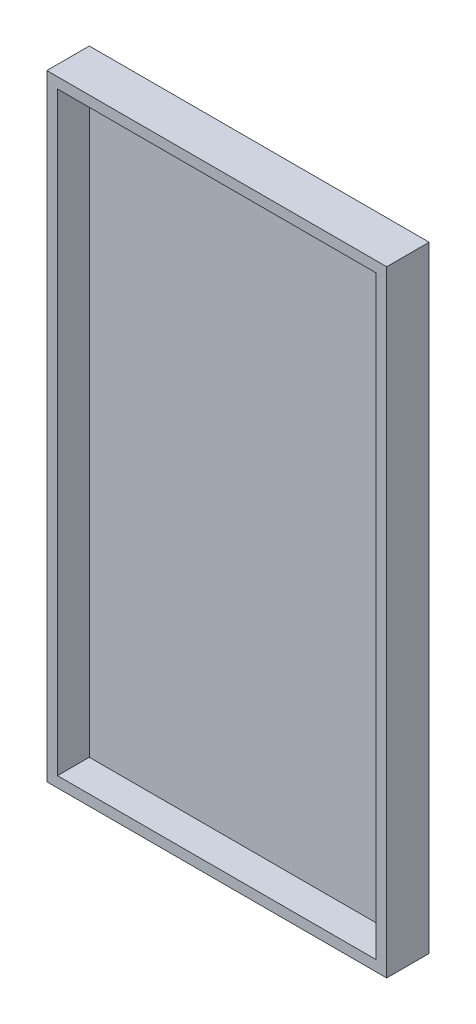
ISO-10303-21;
HEADER;
FILE_DESCRIPTION(('STEP AP214'),'2;1');
FILE_NAME('part.step','',(''),(''),'','','');
FILE_SCHEMA(('AUTOMOTIVE_DESIGN { 1 0 10303 214 1 1 1 1 }'));
ENDSEC;
DATA;
#1=APPLICATION_CONTEXT('core data for automotive mechanical design processes');
#2=APPLICATION_PROTOCOL_DEFINITION('international standard','automotive_design',2000,#1);
#3=PRODUCT_CONTEXT('',#1,'mechanical');
#4=PRODUCT('Part','Part','',(#3));
#5=PRODUCT_RELATED_PRODUCT_CATEGORY('part','',(#4));
#6=PRODUCT_DEFINITION_FORMATION('','',#4);
#7=PRODUCT_DEFINITION_CONTEXT('part definition',#1,'design');
#8=PRODUCT_DEFINITION('design','',#6,#7);
#9=PRODUCT_DEFINITION_SHAPE('','',#8);
#10=(LENGTH_UNIT() NAMED_UNIT(*) SI_UNIT(.MILLI.,.METRE.));
#11=(NAMED_UNIT(*) PLANE_ANGLE_UNIT() SI_UNIT($,.RADIAN.));
#12=(NAMED_UNIT(*) SI_UNIT($,.STERADIAN.) SOLID_ANGLE_UNIT());
#13=UNCERTAINTY_MEASURE_WITH_UNIT(LENGTH_MEASURE(1.E-05),#10,'distance_accuracy_value','');
#14=(GEOMETRIC_REPRESENTATION_CONTEXT(3) GLOBAL_UNCERTAINTY_ASSIGNED_CONTEXT((#13)) GLOBAL_UNIT_ASSIGNED_CONTEXT((#10,
#11,#12)) REPRESENTATION_CONTEXT('',''));
#15=CARTESIAN_POINT('',(0.,0.,0.));
#16=DIRECTION('',(0.,0.,1.));
#17=DIRECTION('',(1.,0.,0.));
#18=AXIS2_PLACEMENT_3D('',#15,#16,#17);
#19=CARTESIAN_POINT('',(0.,0.,2.));
#20=DIRECTION('',(0.,0.,-1.));
#21=DIRECTION('',(-1.,0.,0.));
#22=AXIS2_PLACEMENT_3D('',#19,#20,#21);
#23=PLANE('',#22);
#24=DIRECTION('',(0.,1.,0.));
#25=VECTOR('',#24,1.);
#26=CARTESIAN_POINT('',(16.,-29.,2.));
#27=LINE('',#26,#25);
#28=CARTESIAN_POINT('',(16.,-29.,2.));
#29=VERTEX_POINT('',#28);
#30=CARTESIAN_POINT('',(16.,29.,2.));
#31=VERTEX_POINT('',#30);
#32=EDGE_CURVE('E150',#29,#31,#27,.T.);
#33=ORIENTED_EDGE('',*,*,#32,.T.);
#34=DIRECTION('',(-1.,0.,0.));
#35=VECTOR('',#34,1.);
#36=CARTESIAN_POINT('',(-16.,29.,2.));
#37=LINE('',#36,#35);
#38=CARTESIAN_POINT('',(-16.,29.,2.));
#39=VERTEX_POINT('',#38);
#40=EDGE_CURVE('E91',#31,#39,#37,.T.);
#41=ORIENTED_EDGE('',*,*,#40,.T.);
#42=DIRECTION('',(0.,-1.,0.));
#43=VECTOR('',#42,1.);
#44=CARTESIAN_POINT('',(-16.,-29.,2.));
#45=LINE('',#44,#43);
#46=CARTESIAN_POINT('',(-16.,-29.,2.));
#47=VERTEX_POINT('',#46);
#48=EDGE_CURVE('E148',#39,#47,#45,.T.);
#49=ORIENTED_EDGE('',*,*,#48,.T.);
#50=DIRECTION('',(1.,0.,0.));
#51=VECTOR('',#50,1.);
#52=CARTESIAN_POINT('',(-16.,-29.,2.));
#53=LINE('',#52,#51);
#54=EDGE_CURVE('E61',#47,#29,#53,.T.);
#55=ORIENTED_EDGE('',*,*,#54,.T.);
#56=EDGE_LOOP('',(#33,#41,#49,#55));
#57=FACE_BOUND('',#56,.T.);
#58=DIRECTION('',(0.,1.,0.));
#59=VECTOR('',#58,1.);
#60=CARTESIAN_POINT('',(15.,0.,2.));
#61=LINE('',#60,#59);
#62=CARTESIAN_POINT('',(15.,-28.,2.));
#63=VERTEX_POINT('',#62);
#64=CARTESIAN_POINT('',(15.,28.,2.));
#65=VERTEX_POINT('',#64);
#66=EDGE_CURVE('E136',#63,#65,#61,.T.);
#67=ORIENTED_EDGE('',*,*,#66,.F.);
#68=DIRECTION('',(1.,0.,0.));
#69=VECTOR('',#68,1.);
#70=CARTESIAN_POINT('',(0.,-28.,2.));
#71=LINE('',#70,#69);
#72=CARTESIAN_POINT('',(-15.,-28.,2.));
#73=VERTEX_POINT('',#72);
#74=EDGE_CURVE('E144',#73,#63,#71,.T.);
#75=ORIENTED_EDGE('',*,*,#74,.F.);
#76=DIRECTION('',(0.,-1.,0.));
#77=VECTOR('',#76,1.);
#78=CARTESIAN_POINT('',(-15.,0.,2.));
#79=LINE('',#78,#77);
#80=CARTESIAN_POINT('',(-15.,28.,2.));
#81=VERTEX_POINT('',#80);
#82=EDGE_CURVE('E142',#81,#73,#79,.T.);
#83=ORIENTED_EDGE('',*,*,#82,.F.);
#84=DIRECTION('',(-1.,0.,0.));
#85=VECTOR('',#84,1.);
#86=CARTESIAN_POINT('',(0.,28.,2.));
#87=LINE('',#86,#85);
#88=EDGE_CURVE('E126',#65,#81,#87,.T.);
#89=ORIENTED_EDGE('',*,*,#88,.F.);
#90=EDGE_LOOP('',(#67,#75,#83,#89));
#91=FACE_BOUND('',#90,.T.);
#92=ADVANCED_FACE('F39',(#57,#91),#23,.F.);
#93=CARTESIAN_POINT('',(16.,-29.,2.));
#94=DIRECTION('',(-1.,0.,0.));
#95=DIRECTION('',(0.,0.,1.));
#96=AXIS2_PLACEMENT_3D('',#93,#94,#95);
#97=PLANE('',#96);
#98=DIRECTION('',(0.,1.,0.));
#99=VECTOR('',#98,1.);
#100=CARTESIAN_POINT('',(16.,-29.,-2.));
#101=LINE('',#100,#99);
#102=CARTESIAN_POINT('',(16.,-29.,-2.));
#103=VERTEX_POINT('',#102);
#104=CARTESIAN_POINT('',(16.,29.,-2.));
#105=VERTEX_POINT('',#104);
#106=EDGE_CURVE('E152',#103,#105,#101,.T.);
#107=ORIENTED_EDGE('',*,*,#106,.T.);
#108=DIRECTION('',(0.,0.,-1.));
#109=VECTOR('',#108,1.);
#110=CARTESIAN_POINT('',(16.,29.,2.));
#111=LINE('',#110,#109);
#112=EDGE_CURVE('E11',#31,#105,#111,.T.);
#113=ORIENTED_EDGE('',*,*,#112,.F.);
#114=ORIENTED_EDGE('',*,*,#32,.F.);
#115=DIRECTION('',(0.,0.,-1.));
#116=VECTOR('',#115,1.);
#117=CARTESIAN_POINT('',(16.,-29.,2.));
#118=LINE('',#117,#116);
#119=EDGE_CURVE('E151',#29,#103,#118,.T.);
#120=ORIENTED_EDGE('',*,*,#119,.T.);
#121=EDGE_LOOP('',(#107,#113,#114,#120));
#122=FACE_BOUND('',#121,.T.);
#123=ADVANCED_FACE('F41',(#122),#97,.F.);
#124=CARTESIAN_POINT('',(-16.,29.,2.));
#125=DIRECTION('',(0.,-1.,0.));
#126=DIRECTION('',(0.,0.,-1.));
#127=AXIS2_PLACEMENT_3D('',#124,#125,#126);
#128=PLANE('',#127);
#129=DIRECTION('',(-1.,0.,0.));
#130=VECTOR('',#129,1.);
#131=CARTESIAN_POINT('',(-16.,29.,-2.));
#132=LINE('',#131,#130);
#133=CARTESIAN_POINT('',(-16.,29.,-2.));
#134=VERTEX_POINT('',#133);
#135=EDGE_CURVE('E160',#105,#134,#132,.T.);
#136=ORIENTED_EDGE('',*,*,#135,.T.);
#137=DIRECTION('',(0.,0.,-1.));
#138=VECTOR('',#137,1.);
#139=CARTESIAN_POINT('',(-16.,29.,2.));
#140=LINE('',#139,#138);
#141=EDGE_CURVE('E50',#39,#134,#140,.T.);
#142=ORIENTED_EDGE('',*,*,#141,.F.);
#143=ORIENTED_EDGE('',*,*,#40,.F.);
#144=ORIENTED_EDGE('',*,*,#112,.T.);
#145=EDGE_LOOP('',(#136,#142,#143,#144));
#146=FACE_BOUND('',#145,.T.);
#147=ADVANCED_FACE('F184',(#146),#128,.F.);
#148=CARTESIAN_POINT('',(-16.,-29.,2.));
#149=DIRECTION('',(1.,0.,0.));
#150=DIRECTION('',(0.,0.,-1.));
#151=AXIS2_PLACEMENT_3D('',#148,#149,#150);
#152=PLANE('',#151);
#153=DIRECTION('',(0.,-1.,0.));
#154=VECTOR('',#153,1.);
#155=CARTESIAN_POINT('',(-16.,-29.,-2.));
#156=LINE('',#155,#154);
#157=CARTESIAN_POINT('',(-16.,-29.,-2.));
#158=VERTEX_POINT('',#157);
#159=EDGE_CURVE('E159',#134,#158,#156,.T.);
#160=ORIENTED_EDGE('',*,*,#159,.T.);
#161=DIRECTION('',(0.,0.,-1.));
#162=VECTOR('',#161,1.);
#163=CARTESIAN_POINT('',(-16.,-29.,2.));
#164=LINE('',#163,#162);
#165=EDGE_CURVE('E161',#47,#158,#164,.T.);
#166=ORIENTED_EDGE('',*,*,#165,.F.);
#167=ORIENTED_EDGE('',*,*,#48,.F.);
#168=ORIENTED_EDGE('',*,*,#141,.T.);
#169=EDGE_LOOP('',(#160,#166,#167,#168));
#170=FACE_BOUND('',#169,.T.);
#171=ADVANCED_FACE('F166',(#170),#152,.F.);
#172=CARTESIAN_POINT('',(-16.,-29.,2.));
#173=DIRECTION('',(0.,1.,0.));
#174=DIRECTION('',(0.,0.,1.));
#175=AXIS2_PLACEMENT_3D('',#172,#173,#174);
#176=PLANE('',#175);
#177=DIRECTION('',(1.,0.,0.));
#178=VECTOR('',#177,1.);
#179=CARTESIAN_POINT('',(-16.,-29.,-2.));
#180=LINE('',#179,#178);
#181=EDGE_CURVE('E84',#158,#103,#180,.T.);
#182=ORIENTED_EDGE('',*,*,#181,.T.);
#183=ORIENTED_EDGE('',*,*,#119,.F.);
#184=ORIENTED_EDGE('',*,*,#54,.F.);
#185=ORIENTED_EDGE('',*,*,#165,.T.);
#186=EDGE_LOOP('',(#182,#183,#184,#185));
#187=FACE_BOUND('',#186,.T.);
#188=ADVANCED_FACE('F176',(#187),#176,.F.);
#189=CARTESIAN_POINT('',(0.,0.,-2.));
#190=DIRECTION('',(0.,0.,-1.));
#191=DIRECTION('',(-1.,0.,0.));
#192=AXIS2_PLACEMENT_3D('',#189,#190,#191);
#193=PLANE('',#192);
#194=ORIENTED_EDGE('',*,*,#106,.F.);
#195=ORIENTED_EDGE('',*,*,#181,.F.);
#196=ORIENTED_EDGE('',*,*,#159,.F.);
#197=ORIENTED_EDGE('',*,*,#135,.F.);
#198=EDGE_LOOP('',(#194,#195,#196,#197));
#199=FACE_BOUND('',#198,.T.);
#200=ADVANCED_FACE('F175',(#199),#193,.T.);
#201=CARTESIAN_POINT('',(15.,-29.,2.));
#202=DIRECTION('',(-1.,0.,0.));
#203=DIRECTION('',(0.,0.,1.));
#204=AXIS2_PLACEMENT_3D('',#201,#202,#203);
#205=PLANE('',#204);
#206=DIRECTION('',(0.,1.,0.));
#207=VECTOR('',#206,1.);
#208=CARTESIAN_POINT('',(15.,0.,-1.));
#209=LINE('',#208,#207);
#210=CARTESIAN_POINT('',(15.,-28.,-1.));
#211=VERTEX_POINT('',#210);
#212=CARTESIAN_POINT('',(15.,28.,-1.));
#213=VERTEX_POINT('',#212);
#214=EDGE_CURVE('E117',#211,#213,#209,.T.);
#215=ORIENTED_EDGE('',*,*,#214,.F.);
#216=DIRECTION('',(0.,0.,-1.));
#217=VECTOR('',#216,1.);
#218=CARTESIAN_POINT('',(15.,-28.,2.));
#219=LINE('',#218,#217);
#220=EDGE_CURVE('E137',#63,#211,#219,.T.);
#221=ORIENTED_EDGE('',*,*,#220,.F.);
#222=ORIENTED_EDGE('',*,*,#66,.T.);
#223=DIRECTION('',(0.,0.,-1.));
#224=VECTOR('',#223,1.);
#225=CARTESIAN_POINT('',(15.,28.,2.));
#226=LINE('',#225,#224);
#227=EDGE_CURVE('E131',#65,#213,#226,.T.);
#228=ORIENTED_EDGE('',*,*,#227,.T.);
#229=EDGE_LOOP('',(#215,#221,#222,#228));
#230=FACE_BOUND('',#229,.T.);
#231=ADVANCED_FACE('F183',(#230),#205,.T.);
#232=CARTESIAN_POINT('',(-16.,28.,2.));
#233=DIRECTION('',(0.,-1.,0.));
#234=DIRECTION('',(0.,0.,-1.));
#235=AXIS2_PLACEMENT_3D('',#232,#233,#234);
#236=PLANE('',#235);
#237=DIRECTION('',(-1.,0.,0.));
#238=VECTOR('',#237,1.);
#239=CARTESIAN_POINT('',(0.,28.,-1.));
#240=LINE('',#239,#238);
#241=CARTESIAN_POINT('',(-15.,28.,-1.));
#242=VERTEX_POINT('',#241);
#243=EDGE_CURVE('E111',#213,#242,#240,.T.);
#244=ORIENTED_EDGE('',*,*,#243,.F.);
#245=ORIENTED_EDGE('',*,*,#227,.F.);
#246=ORIENTED_EDGE('',*,*,#88,.T.);
#247=DIRECTION('',(0.,0.,-1.));
#248=VECTOR('',#247,1.);
#249=CARTESIAN_POINT('',(-15.,28.,2.));
#250=LINE('',#249,#248);
#251=EDGE_CURVE('E124',#81,#242,#250,.T.);
#252=ORIENTED_EDGE('',*,*,#251,.T.);
#253=EDGE_LOOP('',(#244,#245,#246,#252));
#254=FACE_BOUND('',#253,.T.);
#255=ADVANCED_FACE('F128',(#254),#236,.T.);
#256=CARTESIAN_POINT('',(-15.,-29.,2.));
#257=DIRECTION('',(1.,0.,0.));
#258=DIRECTION('',(0.,0.,-1.));
#259=AXIS2_PLACEMENT_3D('',#256,#257,#258);
#260=PLANE('',#259);
#261=DIRECTION('',(0.,-1.,0.));
#262=VECTOR('',#261,1.);
#263=CARTESIAN_POINT('',(-15.,0.,-1.));
#264=LINE('',#263,#262);
#265=CARTESIAN_POINT('',(-15.,-28.,-1.));
#266=VERTEX_POINT('',#265);
#267=EDGE_CURVE('E120',#242,#266,#264,.T.);
#268=ORIENTED_EDGE('',*,*,#267,.F.);
#269=ORIENTED_EDGE('',*,*,#251,.F.);
#270=ORIENTED_EDGE('',*,*,#82,.T.);
#271=DIRECTION('',(0.,0.,-1.));
#272=VECTOR('',#271,1.);
#273=CARTESIAN_POINT('',(-15.,-28.,2.));
#274=LINE('',#273,#272);
#275=EDGE_CURVE('E53',#73,#266,#274,.T.);
#276=ORIENTED_EDGE('',*,*,#275,.T.);
#277=EDGE_LOOP('',(#268,#269,#270,#276));
#278=FACE_BOUND('',#277,.T.);
#279=ADVANCED_FACE('F133',(#278),#260,.T.);
#280=CARTESIAN_POINT('',(-16.,-28.,2.));
#281=DIRECTION('',(0.,1.,0.));
#282=DIRECTION('',(0.,0.,1.));
#283=AXIS2_PLACEMENT_3D('',#280,#281,#282);
#284=PLANE('',#283);
#285=DIRECTION('',(1.,0.,0.));
#286=VECTOR('',#285,1.);
#287=CARTESIAN_POINT('',(0.,-28.,-1.));
#288=LINE('',#287,#286);
#289=EDGE_CURVE('E132',#266,#211,#288,.T.);
#290=ORIENTED_EDGE('',*,*,#289,.F.);
#291=ORIENTED_EDGE('',*,*,#275,.F.);
#292=ORIENTED_EDGE('',*,*,#74,.T.);
#293=ORIENTED_EDGE('',*,*,#220,.T.);
#294=EDGE_LOOP('',(#290,#291,#292,#293));
#295=FACE_BOUND('',#294,.T.);
#296=ADVANCED_FACE('F200',(#295),#284,.T.);
#297=CARTESIAN_POINT('',(0.,0.,-1.));
#298=DIRECTION('',(0.,0.,-1.));
#299=DIRECTION('',(-1.,0.,0.));
#300=AXIS2_PLACEMENT_3D('',#297,#298,#299);
#301=PLANE('',#300);
#302=ORIENTED_EDGE('',*,*,#214,.T.);
#303=ORIENTED_EDGE('',*,*,#243,.T.);
#304=ORIENTED_EDGE('',*,*,#267,.T.);
#305=ORIENTED_EDGE('',*,*,#289,.T.);
#306=EDGE_LOOP('',(#302,#303,#304,#305));
#307=FACE_BOUND('',#306,.T.);
#308=ADVANCED_FACE('F113',(#307),#301,.F.);
#309=CLOSED_SHELL('',(#92,#123,#147,#171,#188,#200,#231,#255,#279,#296,#308));
#310=MANIFOLD_SOLID_BREP('B2',#309);
#311=ADVANCED_BREP_SHAPE_REPRESENTATION('',(#18,#310),#14);
#312=SHAPE_DEFINITION_REPRESENTATION(#9,#311);
ENDSEC;
END-ISO-10303-21;
